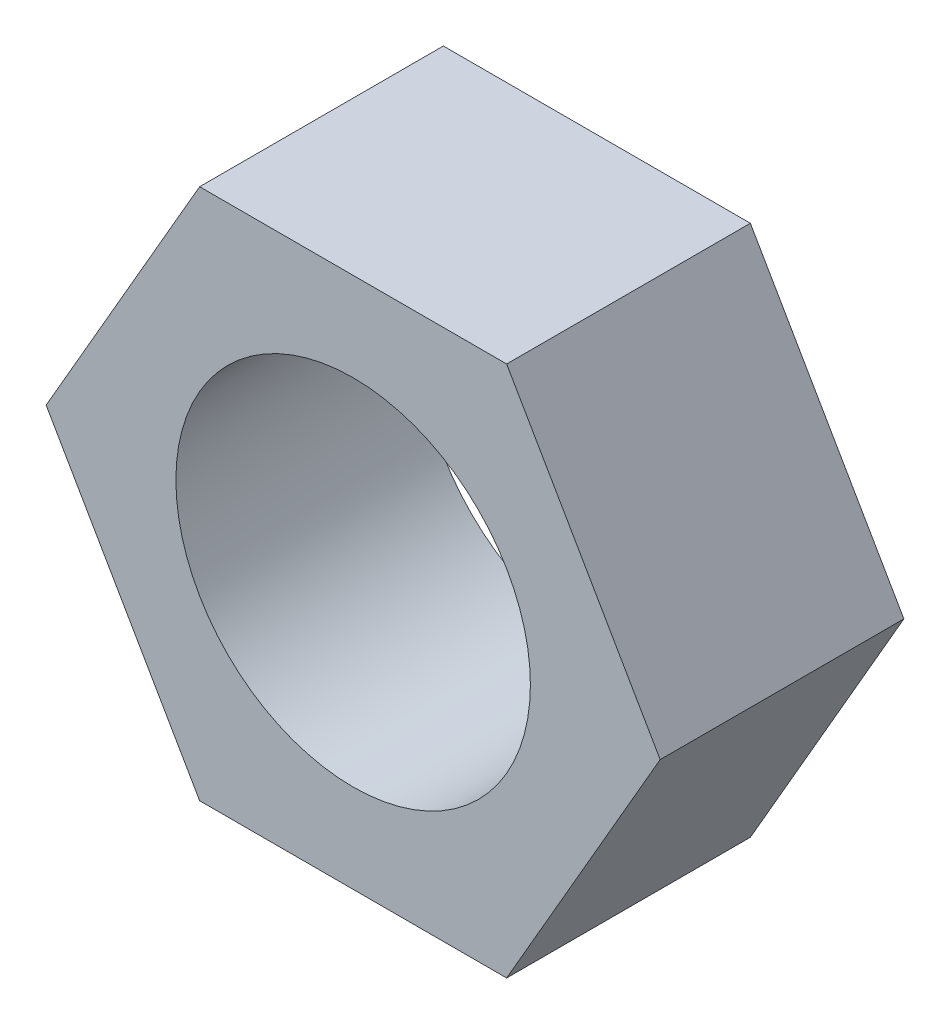
ISO-10303-21;
HEADER;
FILE_DESCRIPTION(('STEP AP214'),'2;1');
FILE_NAME('part.step','',(''),(''),'','','');
FILE_SCHEMA(('AUTOMOTIVE_DESIGN { 1 0 10303 214 1 1 1 1 }'));
ENDSEC;
DATA;
#1=APPLICATION_CONTEXT('core data for automotive mechanical design processes');
#2=APPLICATION_PROTOCOL_DEFINITION('international standard','automotive_design',2000,#1);
#3=PRODUCT_CONTEXT('',#1,'mechanical');
#4=PRODUCT('Part','Part','',(#3));
#5=PRODUCT_RELATED_PRODUCT_CATEGORY('part','',(#4));
#6=PRODUCT_DEFINITION_FORMATION('','',#4);
#7=PRODUCT_DEFINITION_CONTEXT('part definition',#1,'design');
#8=PRODUCT_DEFINITION('design','',#6,#7);
#9=PRODUCT_DEFINITION_SHAPE('','',#8);
#10=(LENGTH_UNIT() NAMED_UNIT(*) SI_UNIT(.MILLI.,.METRE.));
#11=(NAMED_UNIT(*) PLANE_ANGLE_UNIT() SI_UNIT($,.RADIAN.));
#12=(NAMED_UNIT(*) SI_UNIT($,.STERADIAN.) SOLID_ANGLE_UNIT());
#13=UNCERTAINTY_MEASURE_WITH_UNIT(LENGTH_MEASURE(1.E-05),#10,'distance_accuracy_value','');
#14=(GEOMETRIC_REPRESENTATION_CONTEXT(3) GLOBAL_UNCERTAINTY_ASSIGNED_CONTEXT((#13)) GLOBAL_UNIT_ASSIGNED_CONTEXT((#10,
#11,#12)) REPRESENTATION_CONTEXT('',''));
#15=CARTESIAN_POINT('',(0.,0.,0.));
#16=DIRECTION('',(0.,0.,1.));
#17=DIRECTION('',(1.,0.,0.));
#18=AXIS2_PLACEMENT_3D('',#15,#16,#17);
#19=CARTESIAN_POINT('',(0.,0.,5.5));
#20=DIRECTION('',(0.,0.,1.));
#21=DIRECTION('',(1.,0.,0.));
#22=AXIS2_PLACEMENT_3D('',#19,#20,#21);
#23=PLANE('',#22);
#24=DIRECTION('',(-0.5,-0.866025403784439,0.));
#25=VECTOR('',#24,1.);
#26=CARTESIAN_POINT('',(-3.4641016151376,5.99999999999945,5.5));
#27=LINE('',#26,#25);
#28=CARTESIAN_POINT('',(-3.4641016151376,5.99999999999945,5.5));
#29=VERTEX_POINT('',#28);
#30=CARTESIAN_POINT('',(-6.92820323027537,-5.65519853168439E-13,5.5));
#31=VERTEX_POINT('',#30);
#32=EDGE_CURVE('E128',#29,#31,#27,.T.);
#33=ORIENTED_EDGE('',*,*,#32,.T.);
#34=DIRECTION('',(0.5,-0.866025403784439,0.));
#35=VECTOR('',#34,1.);
#36=CARTESIAN_POINT('',(-6.92820323027537,-5.65519853168439E-13,5.5));
#37=LINE('',#36,#35);
#38=CARTESIAN_POINT('',(-3.46410161513761,-6.00000000000058,5.5));
#39=VERTEX_POINT('',#38);
#40=EDGE_CURVE('E86',#31,#39,#37,.T.);
#41=ORIENTED_EDGE('',*,*,#40,.T.);
#42=DIRECTION('',(1.,0.,0.));
#43=VECTOR('',#42,1.);
#44=CARTESIAN_POINT('',(-3.46410161513761,-6.00000000000058,5.5));
#45=LINE('',#44,#43);
#46=CARTESIAN_POINT('',(3.46410161513792,-6.00000000000058,5.5));
#47=VERTEX_POINT('',#46);
#48=EDGE_CURVE('E99',#39,#47,#45,.T.);
#49=ORIENTED_EDGE('',*,*,#48,.T.);
#50=DIRECTION('',(0.5,0.866025403784439,0.));
#51=VECTOR('',#50,1.);
#52=CARTESIAN_POINT('',(3.46410161513792,-6.00000000000058,5.5));
#53=LINE('',#52,#51);
#54=CARTESIAN_POINT('',(6.92820323027568,-5.64133644211979E-13,5.5));
#55=VERTEX_POINT('',#54);
#56=EDGE_CURVE('E93',#47,#55,#53,.T.);
#57=ORIENTED_EDGE('',*,*,#56,.T.);
#58=DIRECTION('',(-0.5,0.866025403784439,0.));
#59=VECTOR('',#58,1.);
#60=CARTESIAN_POINT('',(6.92820323027568,-5.64133644211979E-13,5.5));
#61=LINE('',#60,#59);
#62=CARTESIAN_POINT('',(3.46410161513792,5.99999999999945,5.5));
#63=VERTEX_POINT('',#62);
#64=EDGE_CURVE('E97',#55,#63,#61,.T.);
#65=ORIENTED_EDGE('',*,*,#64,.T.);
#66=DIRECTION('',(-1.,0.,0.));
#67=VECTOR('',#66,1.);
#68=CARTESIAN_POINT('',(3.46410161513792,5.99999999999945,5.5));
#69=LINE('',#68,#67);
#70=EDGE_CURVE('E49',#63,#29,#69,.T.);
#71=ORIENTED_EDGE('',*,*,#70,.T.);
#72=EDGE_LOOP('',(#33,#41,#49,#57,#65,#71));
#73=FACE_BOUND('',#72,.T.);
#74=CARTESIAN_POINT('',(1.56125112837913E-13,-5.66838243010181E-13,5.5));
#75=DIRECTION('',(0.,0.,1.));
#76=DIRECTION('',(1.,0.,0.));
#77=AXIS2_PLACEMENT_3D('',#74,#75,#76);
#78=CIRCLE('',#77,4.00000000000001);
#79=CARTESIAN_POINT('',(4.00000000000017,-5.66838243010181E-13,5.5));
#80=VERTEX_POINT('',#79);
#81=EDGE_CURVE('E121',#80,#80,#78,.T.);
#82=ORIENTED_EDGE('',*,*,#81,.F.);
#83=EDGE_LOOP('',(#82));
#84=FACE_BOUND('',#83,.T.);
#85=ADVANCED_FACE('F32',(#73,#84),#23,.T.);
#86=CARTESIAN_POINT('',(0.,0.,0.));
#87=DIRECTION('',(0.,0.,1.));
#88=DIRECTION('',(1.,0.,0.));
#89=AXIS2_PLACEMENT_3D('',#86,#87,#88);
#90=PLANE('',#89);
#91=DIRECTION('',(-0.5,-0.866025403784439,0.));
#92=VECTOR('',#91,1.);
#93=CARTESIAN_POINT('',(-3.4641016151376,5.99999999999945,0.));
#94=LINE('',#93,#92);
#95=CARTESIAN_POINT('',(-3.4641016151376,5.99999999999945,0.));
#96=VERTEX_POINT('',#95);
#97=CARTESIAN_POINT('',(-6.92820323027537,-5.65519853168439E-13,0.));
#98=VERTEX_POINT('',#97);
#99=EDGE_CURVE('E117',#96,#98,#94,.T.);
#100=ORIENTED_EDGE('',*,*,#99,.F.);
#101=DIRECTION('',(-1.,0.,0.));
#102=VECTOR('',#101,1.);
#103=CARTESIAN_POINT('',(3.46410161513792,5.99999999999945,0.));
#104=LINE('',#103,#102);
#105=CARTESIAN_POINT('',(3.46410161513792,5.99999999999945,0.));
#106=VERTEX_POINT('',#105);
#107=EDGE_CURVE('E78',#106,#96,#104,.T.);
#108=ORIENTED_EDGE('',*,*,#107,.F.);
#109=DIRECTION('',(-0.5,0.866025403784439,0.));
#110=VECTOR('',#109,1.);
#111=CARTESIAN_POINT('',(6.92820323027568,-5.64133644211979E-13,0.));
#112=LINE('',#111,#110);
#113=CARTESIAN_POINT('',(6.92820323027568,-5.64133644211979E-13,0.));
#114=VERTEX_POINT('',#113);
#115=EDGE_CURVE('E72',#114,#106,#112,.T.);
#116=ORIENTED_EDGE('',*,*,#115,.F.);
#117=DIRECTION('',(0.5,0.866025403784439,0.));
#118=VECTOR('',#117,1.);
#119=CARTESIAN_POINT('',(3.46410161513792,-6.00000000000058,0.));
#120=LINE('',#119,#118);
#121=CARTESIAN_POINT('',(3.46410161513792,-6.00000000000058,0.));
#122=VERTEX_POINT('',#121);
#123=EDGE_CURVE('E107',#122,#114,#120,.T.);
#124=ORIENTED_EDGE('',*,*,#123,.F.);
#125=DIRECTION('',(1.,0.,0.));
#126=VECTOR('',#125,1.);
#127=CARTESIAN_POINT('',(-3.46410161513761,-6.00000000000058,0.));
#128=LINE('',#127,#126);
#129=CARTESIAN_POINT('',(-3.46410161513761,-6.00000000000058,0.));
#130=VERTEX_POINT('',#129);
#131=EDGE_CURVE('E123',#130,#122,#128,.T.);
#132=ORIENTED_EDGE('',*,*,#131,.F.);
#133=DIRECTION('',(0.5,-0.866025403784439,0.));
#134=VECTOR('',#133,1.);
#135=CARTESIAN_POINT('',(-6.92820323027537,-5.65519853168439E-13,0.));
#136=LINE('',#135,#134);
#137=EDGE_CURVE('E120',#98,#130,#136,.T.);
#138=ORIENTED_EDGE('',*,*,#137,.F.);
#139=EDGE_LOOP('',(#100,#108,#116,#124,#132,#138));
#140=FACE_BOUND('',#139,.T.);
#141=CARTESIAN_POINT('',(1.56125112837913E-13,-5.66838243010181E-13,0.));
#142=DIRECTION('',(0.,0.,1.));
#143=DIRECTION('',(1.,0.,0.));
#144=AXIS2_PLACEMENT_3D('',#141,#142,#143);
#145=CIRCLE('',#144,4.00000000000001);
#146=CARTESIAN_POINT('',(4.00000000000017,-5.66838243010181E-13,0.));
#147=VERTEX_POINT('',#146);
#148=EDGE_CURVE('E221',#147,#147,#145,.T.);
#149=ORIENTED_EDGE('',*,*,#148,.T.);
#150=EDGE_LOOP('',(#149));
#151=FACE_BOUND('',#150,.T.);
#152=ADVANCED_FACE('F137',(#140,#151),#90,.F.);
#153=CARTESIAN_POINT('',(-3.4641016151376,5.99999999999945,5.5));
#154=DIRECTION('',(0.866025403784439,-0.5,0.));
#155=DIRECTION('',(0.5,0.866025403784439,0.));
#156=AXIS2_PLACEMENT_3D('',#153,#154,#155);
#157=PLANE('',#156);
#158=ORIENTED_EDGE('',*,*,#99,.T.);
#159=DIRECTION('',(0.,0.,-1.));
#160=VECTOR('',#159,1.);
#161=CARTESIAN_POINT('',(-6.92820323027537,-5.65519853168439E-13,5.5));
#162=LINE('',#161,#160);
#163=EDGE_CURVE('E11',#31,#98,#162,.T.);
#164=ORIENTED_EDGE('',*,*,#163,.F.);
#165=ORIENTED_EDGE('',*,*,#32,.F.);
#166=DIRECTION('',(0.,0.,-1.));
#167=VECTOR('',#166,1.);
#168=CARTESIAN_POINT('',(-3.4641016151376,5.99999999999945,5.5));
#169=LINE('',#168,#167);
#170=EDGE_CURVE('E113',#29,#96,#169,.T.);
#171=ORIENTED_EDGE('',*,*,#170,.T.);
#172=EDGE_LOOP('',(#158,#164,#165,#171));
#173=FACE_BOUND('',#172,.T.);
#174=ADVANCED_FACE('F34',(#173),#157,.F.);
#175=CARTESIAN_POINT('',(-6.92820323027537,-5.65519853168439E-13,5.5));
#176=DIRECTION('',(0.866025403784439,0.5,0.));
#177=DIRECTION('',(-0.5,0.866025403784439,0.));
#178=AXIS2_PLACEMENT_3D('',#175,#176,#177);
#179=PLANE('',#178);
#180=ORIENTED_EDGE('',*,*,#137,.T.);
#181=DIRECTION('',(0.,0.,-1.));
#182=VECTOR('',#181,1.);
#183=CARTESIAN_POINT('',(-3.46410161513761,-6.00000000000058,5.5));
#184=LINE('',#183,#182);
#185=EDGE_CURVE('E41',#39,#130,#184,.T.);
#186=ORIENTED_EDGE('',*,*,#185,.F.);
#187=ORIENTED_EDGE('',*,*,#40,.F.);
#188=ORIENTED_EDGE('',*,*,#163,.T.);
#189=EDGE_LOOP('',(#180,#186,#187,#188));
#190=FACE_BOUND('',#189,.T.);
#191=ADVANCED_FACE('F162',(#190),#179,.F.);
#192=CARTESIAN_POINT('',(-3.46410161513761,-6.00000000000058,5.5));
#193=DIRECTION('',(0.,1.,0.));
#194=DIRECTION('',(-1.,0.,0.));
#195=AXIS2_PLACEMENT_3D('',#192,#193,#194);
#196=PLANE('',#195);
#197=ORIENTED_EDGE('',*,*,#131,.T.);
#198=DIRECTION('',(0.,0.,-1.));
#199=VECTOR('',#198,1.);
#200=CARTESIAN_POINT('',(3.46410161513792,-6.00000000000058,5.5));
#201=LINE('',#200,#199);
#202=EDGE_CURVE('E108',#47,#122,#201,.T.);
#203=ORIENTED_EDGE('',*,*,#202,.F.);
#204=ORIENTED_EDGE('',*,*,#48,.F.);
#205=ORIENTED_EDGE('',*,*,#185,.T.);
#206=EDGE_LOOP('',(#197,#203,#204,#205));
#207=FACE_BOUND('',#206,.T.);
#208=ADVANCED_FACE('F134',(#207),#196,.F.);
#209=CARTESIAN_POINT('',(3.46410161513792,-6.00000000000058,5.5));
#210=DIRECTION('',(-0.866025403784439,0.5,0.));
#211=DIRECTION('',(-0.5,-0.866025403784439,0.));
#212=AXIS2_PLACEMENT_3D('',#209,#210,#211);
#213=PLANE('',#212);
#214=ORIENTED_EDGE('',*,*,#123,.T.);
#215=DIRECTION('',(0.,0.,-1.));
#216=VECTOR('',#215,1.);
#217=CARTESIAN_POINT('',(6.92820323027568,-5.64133644211979E-13,5.5));
#218=LINE('',#217,#216);
#219=EDGE_CURVE('E104',#55,#114,#218,.T.);
#220=ORIENTED_EDGE('',*,*,#219,.F.);
#221=ORIENTED_EDGE('',*,*,#56,.F.);
#222=ORIENTED_EDGE('',*,*,#202,.T.);
#223=EDGE_LOOP('',(#214,#220,#221,#222));
#224=FACE_BOUND('',#223,.T.);
#225=ADVANCED_FACE('F105',(#224),#213,.F.);
#226=CARTESIAN_POINT('',(6.92820323027568,-5.64133644211979E-13,5.5));
#227=DIRECTION('',(-0.866025403784439,-0.5,0.));
#228=DIRECTION('',(0.5,-0.866025403784439,0.));
#229=AXIS2_PLACEMENT_3D('',#226,#227,#228);
#230=PLANE('',#229);
#231=ORIENTED_EDGE('',*,*,#115,.T.);
#232=DIRECTION('',(0.,0.,-1.));
#233=VECTOR('',#232,1.);
#234=CARTESIAN_POINT('',(3.46410161513792,5.99999999999945,5.5));
#235=LINE('',#234,#233);
#236=EDGE_CURVE('E109',#63,#106,#235,.T.);
#237=ORIENTED_EDGE('',*,*,#236,.F.);
#238=ORIENTED_EDGE('',*,*,#64,.F.);
#239=ORIENTED_EDGE('',*,*,#219,.T.);
#240=EDGE_LOOP('',(#231,#237,#238,#239));
#241=FACE_BOUND('',#240,.T.);
#242=ADVANCED_FACE('F111',(#241),#230,.F.);
#243=CARTESIAN_POINT('',(3.46410161513792,5.99999999999945,5.5));
#244=DIRECTION('',(0.,-1.,0.));
#245=DIRECTION('',(0.,0.,-1.));
#246=AXIS2_PLACEMENT_3D('',#243,#244,#245);
#247=PLANE('',#246);
#248=ORIENTED_EDGE('',*,*,#107,.T.);
#249=ORIENTED_EDGE('',*,*,#170,.F.);
#250=ORIENTED_EDGE('',*,*,#70,.F.);
#251=ORIENTED_EDGE('',*,*,#236,.T.);
#252=EDGE_LOOP('',(#248,#249,#250,#251));
#253=FACE_BOUND('',#252,.T.);
#254=ADVANCED_FACE('F142',(#253),#247,.F.);
#255=CARTESIAN_POINT('',(1.56125112837913E-13,-5.66838243010181E-13,5.5));
#256=DIRECTION('',(0.,0.,-1.));
#257=DIRECTION('',(-1.,0.,0.));
#258=AXIS2_PLACEMENT_3D('',#255,#256,#257);
#259=CYLINDRICAL_SURFACE('',#258,4.00000000000001);
#260=ORIENTED_EDGE('',*,*,#81,.T.);
#261=EDGE_LOOP('',(#260));
#262=FACE_BOUND('',#261,.T.);
#263=ORIENTED_EDGE('',*,*,#148,.F.);
#264=EDGE_LOOP('',(#263));
#265=FACE_BOUND('',#264,.T.);
#266=ADVANCED_FACE('F144',(#262,#265),#259,.F.);
#267=CLOSED_SHELL('',(#85,#152,#174,#191,#208,#225,#242,#254,#266));
#268=MANIFOLD_SOLID_BREP('B2',#267);
#269=ADVANCED_BREP_SHAPE_REPRESENTATION('',(#18,#268),#14);
#270=SHAPE_DEFINITION_REPRESENTATION(#9,#269);
ENDSEC;
END-ISO-10303-21;
